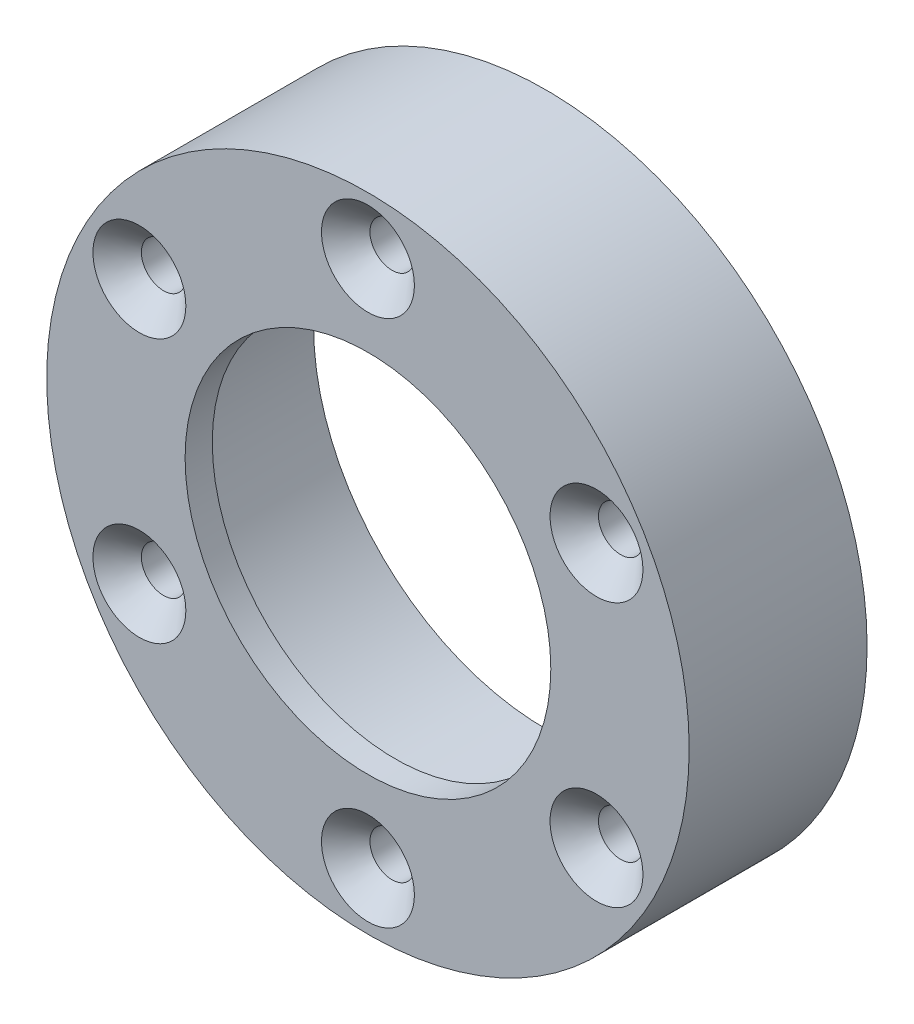
ISO-10303-21;
HEADER;
FILE_DESCRIPTION(('STEP AP214'),'2;1');
FILE_NAME('part.step','',(''),(''),'','','');
FILE_SCHEMA(('AUTOMOTIVE_DESIGN { 1 0 10303 214 1 1 1 1 }'));
ENDSEC;
DATA;
#1=APPLICATION_CONTEXT('core data for automotive mechanical design processes');
#2=APPLICATION_PROTOCOL_DEFINITION('international standard','automotive_design',2000,#1);
#3=PRODUCT_CONTEXT('',#1,'mechanical');
#4=PRODUCT('Part','Part','',(#3));
#5=PRODUCT_RELATED_PRODUCT_CATEGORY('part','',(#4));
#6=PRODUCT_DEFINITION_FORMATION('','',#4);
#7=PRODUCT_DEFINITION_CONTEXT('part definition',#1,'design');
#8=PRODUCT_DEFINITION('design','',#6,#7);
#9=PRODUCT_DEFINITION_SHAPE('','',#8);
#10=(LENGTH_UNIT() NAMED_UNIT(*) SI_UNIT(.MILLI.,.METRE.));
#11=(NAMED_UNIT(*) PLANE_ANGLE_UNIT() SI_UNIT($,.RADIAN.));
#12=(NAMED_UNIT(*) SI_UNIT($,.STERADIAN.) SOLID_ANGLE_UNIT());
#13=UNCERTAINTY_MEASURE_WITH_UNIT(LENGTH_MEASURE(1.E-05),#10,'distance_accuracy_value','');
#14=(GEOMETRIC_REPRESENTATION_CONTEXT(3) GLOBAL_UNCERTAINTY_ASSIGNED_CONTEXT((#13)) GLOBAL_UNIT_ASSIGNED_CONTEXT((#10,
#11,#12)) REPRESENTATION_CONTEXT('',''));
#15=CARTESIAN_POINT('',(0.,0.,0.));
#16=DIRECTION('',(0.,0.,1.));
#17=DIRECTION('',(1.,0.,0.));
#18=AXIS2_PLACEMENT_3D('',#15,#16,#17);
#19=CARTESIAN_POINT('',(0.,0.,30.));
#20=DIRECTION('',(0.,0.,-1.));
#21=DIRECTION('',(-1.,0.,0.));
#22=AXIS2_PLACEMENT_3D('',#19,#20,#21);
#23=CYLINDRICAL_SURFACE('',#22,18.5);
#24=CARTESIAN_POINT('',(0.,0.,18.));
#25=DIRECTION('',(0.,0.,1.));
#26=DIRECTION('',(1.,0.,0.));
#27=AXIS2_PLACEMENT_3D('',#24,#25,#26);
#28=CIRCLE('',#27,18.5);
#29=CARTESIAN_POINT('',(18.5,0.,18.));
#30=VERTEX_POINT('',#29);
#31=EDGE_CURVE('E105',#30,#30,#28,.T.);
#32=ORIENTED_EDGE('',*,*,#31,.T.);
#33=EDGE_LOOP('',(#32));
#34=FACE_BOUND('',#33,.T.);
#35=CARTESIAN_POINT('',(0.,0.,15.25));
#36=DIRECTION('',(0.,0.,-1.));
#37=DIRECTION('',(-1.,0.,0.));
#38=AXIS2_PLACEMENT_3D('',#35,#36,#37);
#39=CIRCLE('',#38,18.5);
#40=CARTESIAN_POINT('',(-18.5,0.,15.25));
#41=VERTEX_POINT('',#40);
#42=EDGE_CURVE('E41',#41,#41,#39,.F.);
#43=ORIENTED_EDGE('',*,*,#42,.F.);
#44=EDGE_LOOP('',(#43));
#45=FACE_BOUND('',#44,.T.);
#46=ADVANCED_FACE('F37',(#34,#45),#23,.F.);
#47=CARTESIAN_POINT('',(0.,0.,18.));
#48=DIRECTION('',(0.,0.,-1.));
#49=DIRECTION('',(-1.,0.,0.));
#50=AXIS2_PLACEMENT_3D('',#47,#48,#49);
#51=CYLINDRICAL_SURFACE('',#50,32.5);
#52=CARTESIAN_POINT('',(0.,0.,18.));
#53=DIRECTION('',(0.,0.,1.));
#54=DIRECTION('',(1.,0.,0.));
#55=AXIS2_PLACEMENT_3D('',#52,#53,#54);
#56=CIRCLE('',#55,32.5);
#57=CARTESIAN_POINT('',(32.5,0.,18.));
#58=VERTEX_POINT('',#57);
#59=EDGE_CURVE('E10',#58,#58,#56,.T.);
#60=ORIENTED_EDGE('',*,*,#59,.F.);
#61=EDGE_LOOP('',(#60));
#62=FACE_BOUND('',#61,.T.);
#63=CARTESIAN_POINT('',(0.,0.,0.));
#64=DIRECTION('',(0.,0.,1.));
#65=DIRECTION('',(1.,0.,0.));
#66=AXIS2_PLACEMENT_3D('',#63,#64,#65);
#67=CIRCLE('',#66,32.5);
#68=CARTESIAN_POINT('',(32.5,0.,0.));
#69=VERTEX_POINT('',#68);
#70=EDGE_CURVE('E45',#69,#69,#67,.T.);
#71=ORIENTED_EDGE('',*,*,#70,.T.);
#72=EDGE_LOOP('',(#71));
#73=FACE_BOUND('',#72,.T.);
#74=ADVANCED_FACE('F39',(#62,#73),#51,.T.);
#75=CARTESIAN_POINT('',(0.,0.,18.));
#76=DIRECTION('',(0.,0.,1.));
#77=DIRECTION('',(1.,0.,0.));
#78=AXIS2_PLACEMENT_3D('',#75,#76,#77);
#79=PLANE('',#78);
#80=ORIENTED_EDGE('',*,*,#31,.F.);
#81=EDGE_LOOP('',(#80));
#82=FACE_BOUND('',#81,.T.);
#83=CARTESIAN_POINT('',(23.1228782810444,13.3500000000003,18.));
#84=DIRECTION('',(0.,0.,1.));
#85=DIRECTION('',(1.,0.,0.));
#86=AXIS2_PLACEMENT_3D('',#83,#84,#85);
#87=CIRCLE('',#86,4.7);
#88=CARTESIAN_POINT('',(27.8228782810444,13.3500000000003,18.));
#89=VERTEX_POINT('',#88);
#90=EDGE_CURVE('E102',#89,#89,#87,.T.);
#91=ORIENTED_EDGE('',*,*,#90,.F.);
#92=EDGE_LOOP('',(#91));
#93=FACE_BOUND('',#92,.T.);
#94=CARTESIAN_POINT('',(23.1228782810446,-13.3499999999998,18.));
#95=DIRECTION('',(0.,0.,1.));
#96=DIRECTION('',(1.,0.,0.));
#97=AXIS2_PLACEMENT_3D('',#94,#95,#96);
#98=CIRCLE('',#97,4.7);
#99=CARTESIAN_POINT('',(27.8228782810446,-13.3499999999998,18.));
#100=VERTEX_POINT('',#99);
#101=EDGE_CURVE('E93',#100,#100,#98,.T.);
#102=ORIENTED_EDGE('',*,*,#101,.F.);
#103=EDGE_LOOP('',(#102));
#104=FACE_BOUND('',#103,.T.);
#105=CARTESIAN_POINT('',(0.,-26.7,18.));
#106=DIRECTION('',(0.,0.,1.));
#107=DIRECTION('',(1.,0.,0.));
#108=AXIS2_PLACEMENT_3D('',#105,#106,#107);
#109=CIRCLE('',#108,4.7);
#110=CARTESIAN_POINT('',(4.7,-26.7,18.));
#111=VERTEX_POINT('',#110);
#112=EDGE_CURVE('E84',#111,#111,#109,.T.);
#113=ORIENTED_EDGE('',*,*,#112,.F.);
#114=EDGE_LOOP('',(#113));
#115=FACE_BOUND('',#114,.T.);
#116=CARTESIAN_POINT('',(-23.1228782810444,-13.3500000000001,18.));
#117=DIRECTION('',(0.,0.,1.));
#118=DIRECTION('',(1.,0.,0.));
#119=AXIS2_PLACEMENT_3D('',#116,#117,#118);
#120=CIRCLE('',#119,4.7);
#121=CARTESIAN_POINT('',(-18.4228782810445,-13.3500000000001,18.));
#122=VERTEX_POINT('',#121);
#123=EDGE_CURVE('E75',#122,#122,#120,.T.);
#124=ORIENTED_EDGE('',*,*,#123,.F.);
#125=EDGE_LOOP('',(#124));
#126=FACE_BOUND('',#125,.T.);
#127=CARTESIAN_POINT('',(-23.1228782810445,13.3499999999999,18.));
#128=DIRECTION('',(0.,0.,1.));
#129=DIRECTION('',(1.,0.,0.));
#130=AXIS2_PLACEMENT_3D('',#127,#128,#129);
#131=CIRCLE('',#130,4.7);
#132=CARTESIAN_POINT('',(-18.4228782810445,13.3499999999999,18.));
#133=VERTEX_POINT('',#132);
#134=EDGE_CURVE('E66',#133,#133,#131,.T.);
#135=ORIENTED_EDGE('',*,*,#134,.F.);
#136=EDGE_LOOP('',(#135));
#137=FACE_BOUND('',#136,.T.);
#138=CARTESIAN_POINT('',(0.,26.7,18.));
#139=DIRECTION('',(0.,0.,1.));
#140=DIRECTION('',(1.,0.,0.));
#141=AXIS2_PLACEMENT_3D('',#138,#139,#140);
#142=CIRCLE('',#141,4.7);
#143=CARTESIAN_POINT('',(4.7,26.7,18.));
#144=VERTEX_POINT('',#143);
#145=EDGE_CURVE('E57',#144,#144,#142,.T.);
#146=ORIENTED_EDGE('',*,*,#145,.F.);
#147=EDGE_LOOP('',(#146));
#148=FACE_BOUND('',#147,.T.);
#149=ORIENTED_EDGE('',*,*,#59,.T.);
#150=EDGE_LOOP('',(#149));
#151=FACE_BOUND('',#150,.T.);
#152=ADVANCED_FACE('F128',(#82,#93,#104,#115,#126,#137,#148,#151),#79,.T.);
#153=CARTESIAN_POINT('',(0.,0.,0.));
#154=DIRECTION('',(0.,0.,1.));
#155=DIRECTION('',(1.,0.,0.));
#156=AXIS2_PLACEMENT_3D('',#153,#154,#155);
#157=PLANE('',#156);
#158=CARTESIAN_POINT('',(0.,0.,0.));
#159=DIRECTION('',(0.,0.,-1.));
#160=DIRECTION('',(-1.,0.,0.));
#161=AXIS2_PLACEMENT_3D('',#158,#159,#160);
#162=CIRCLE('',#161,23.5);
#163=CARTESIAN_POINT('',(-23.5,0.,0.));
#164=VERTEX_POINT('',#163);
#165=EDGE_CURVE('E108',#164,#164,#162,.T.);
#166=ORIENTED_EDGE('',*,*,#165,.F.);
#167=EDGE_LOOP('',(#166));
#168=FACE_BOUND('',#167,.T.);
#169=CARTESIAN_POINT('',(23.1228782810444,13.3500000000003,0.));
#170=DIRECTION('',(0.,0.,1.));
#171=DIRECTION('',(1.,0.,0.));
#172=AXIS2_PLACEMENT_3D('',#169,#170,#171);
#173=CIRCLE('',#172,2.25);
#174=CARTESIAN_POINT('',(25.3728782810444,13.3500000000003,0.));
#175=VERTEX_POINT('',#174);
#176=EDGE_CURVE('E96',#175,#175,#173,.T.);
#177=ORIENTED_EDGE('',*,*,#176,.T.);
#178=EDGE_LOOP('',(#177));
#179=FACE_BOUND('',#178,.T.);
#180=CARTESIAN_POINT('',(23.1228782810446,-13.3499999999998,0.));
#181=DIRECTION('',(0.,0.,1.));
#182=DIRECTION('',(1.,0.,0.));
#183=AXIS2_PLACEMENT_3D('',#180,#181,#182);
#184=CIRCLE('',#183,2.25);
#185=CARTESIAN_POINT('',(25.3728782810446,-13.3499999999998,0.));
#186=VERTEX_POINT('',#185);
#187=EDGE_CURVE('E87',#186,#186,#184,.T.);
#188=ORIENTED_EDGE('',*,*,#187,.T.);
#189=EDGE_LOOP('',(#188));
#190=FACE_BOUND('',#189,.T.);
#191=CARTESIAN_POINT('',(0.,-26.7,0.));
#192=DIRECTION('',(0.,0.,1.));
#193=DIRECTION('',(1.,0.,0.));
#194=AXIS2_PLACEMENT_3D('',#191,#192,#193);
#195=CIRCLE('',#194,2.25);
#196=CARTESIAN_POINT('',(2.25,-26.7,0.));
#197=VERTEX_POINT('',#196);
#198=EDGE_CURVE('E78',#197,#197,#195,.T.);
#199=ORIENTED_EDGE('',*,*,#198,.T.);
#200=EDGE_LOOP('',(#199));
#201=FACE_BOUND('',#200,.T.);
#202=CARTESIAN_POINT('',(-23.1228782810444,-13.3500000000001,0.));
#203=DIRECTION('',(0.,0.,1.));
#204=DIRECTION('',(1.,0.,0.));
#205=AXIS2_PLACEMENT_3D('',#202,#203,#204);
#206=CIRCLE('',#205,2.25);
#207=CARTESIAN_POINT('',(-20.8728782810445,-13.3500000000001,0.));
#208=VERTEX_POINT('',#207);
#209=EDGE_CURVE('E69',#208,#208,#206,.T.);
#210=ORIENTED_EDGE('',*,*,#209,.T.);
#211=EDGE_LOOP('',(#210));
#212=FACE_BOUND('',#211,.T.);
#213=CARTESIAN_POINT('',(-23.1228782810445,13.3499999999999,0.));
#214=DIRECTION('',(0.,0.,1.));
#215=DIRECTION('',(1.,0.,0.));
#216=AXIS2_PLACEMENT_3D('',#213,#214,#215);
#217=CIRCLE('',#216,2.25);
#218=CARTESIAN_POINT('',(-20.8728782810445,13.3499999999999,0.));
#219=VERTEX_POINT('',#218);
#220=EDGE_CURVE('E60',#219,#219,#217,.T.);
#221=ORIENTED_EDGE('',*,*,#220,.T.);
#222=EDGE_LOOP('',(#221));
#223=FACE_BOUND('',#222,.T.);
#224=CARTESIAN_POINT('',(0.,26.7,0.));
#225=DIRECTION('',(0.,0.,1.));
#226=DIRECTION('',(1.,0.,0.));
#227=AXIS2_PLACEMENT_3D('',#224,#225,#226);
#228=CIRCLE('',#227,2.25);
#229=CARTESIAN_POINT('',(2.25,26.7,0.));
#230=VERTEX_POINT('',#229);
#231=EDGE_CURVE('E50',#230,#230,#228,.T.);
#232=ORIENTED_EDGE('',*,*,#231,.T.);
#233=EDGE_LOOP('',(#232));
#234=FACE_BOUND('',#233,.T.);
#235=ORIENTED_EDGE('',*,*,#70,.F.);
#236=EDGE_LOOP('',(#235));
#237=FACE_BOUND('',#236,.T.);
#238=ADVANCED_FACE('F181',(#168,#179,#190,#201,#212,#223,#234,#237),#157,.F.);
#239=CARTESIAN_POINT('',(0.,26.7,18.));
#240=DIRECTION('',(0.,0.,1.));
#241=DIRECTION('',(1.,0.,0.));
#242=AXIS2_PLACEMENT_3D('',#239,#240,#241);
#243=CYLINDRICAL_SURFACE('',#242,2.25);
#244=ORIENTED_EDGE('',*,*,#231,.F.);
#245=EDGE_LOOP('',(#244));
#246=FACE_BOUND('',#245,.T.);
#247=CARTESIAN_POINT('',(0.,26.7,15.55));
#248=DIRECTION('',(0.,0.,1.));
#249=DIRECTION('',(1.,0.,0.));
#250=AXIS2_PLACEMENT_3D('',#247,#248,#249);
#251=CIRCLE('',#250,2.25);
#252=CARTESIAN_POINT('',(2.25,26.7,15.55));
#253=VERTEX_POINT('',#252);
#254=EDGE_CURVE('E54',#253,#253,#251,.T.);
#255=ORIENTED_EDGE('',*,*,#254,.T.);
#256=EDGE_LOOP('',(#255));
#257=FACE_BOUND('',#256,.T.);
#258=ADVANCED_FACE('F177',(#246,#257),#243,.F.);
#259=CARTESIAN_POINT('',(0.,26.7,18.));
#260=DIRECTION('',(0.,0.,1.));
#261=DIRECTION('',(1.,0.,0.));
#262=AXIS2_PLACEMENT_3D('',#259,#260,#261);
#263=CONICAL_SURFACE('',#262,4.7,0.785398163397449);
#264=ORIENTED_EDGE('',*,*,#254,.F.);
#265=EDGE_LOOP('',(#264));
#266=FACE_BOUND('',#265,.T.);
#267=ORIENTED_EDGE('',*,*,#145,.T.);
#268=EDGE_LOOP('',(#267));
#269=FACE_BOUND('',#268,.T.);
#270=ADVANCED_FACE('F173',(#266,#269),#263,.F.);
#271=CARTESIAN_POINT('',(-23.1228782810445,13.3499999999999,18.));
#272=DIRECTION('',(0.,0.,1.));
#273=DIRECTION('',(1.,0.,0.));
#274=AXIS2_PLACEMENT_3D('',#271,#272,#273);
#275=CYLINDRICAL_SURFACE('',#274,2.25);
#276=ORIENTED_EDGE('',*,*,#220,.F.);
#277=EDGE_LOOP('',(#276));
#278=FACE_BOUND('',#277,.T.);
#279=CARTESIAN_POINT('',(-23.1228782810445,13.3499999999999,15.55));
#280=DIRECTION('',(0.,0.,1.));
#281=DIRECTION('',(1.,0.,0.));
#282=AXIS2_PLACEMENT_3D('',#279,#280,#281);
#283=CIRCLE('',#282,2.25);
#284=CARTESIAN_POINT('',(-20.8728782810445,13.3499999999999,15.55));
#285=VERTEX_POINT('',#284);
#286=EDGE_CURVE('E63',#285,#285,#283,.T.);
#287=ORIENTED_EDGE('',*,*,#286,.T.);
#288=EDGE_LOOP('',(#287));
#289=FACE_BOUND('',#288,.T.);
#290=ADVANCED_FACE('F169',(#278,#289),#275,.F.);
#291=CARTESIAN_POINT('',(-23.1228782810445,13.3499999999999,18.));
#292=DIRECTION('',(0.,0.,1.));
#293=DIRECTION('',(1.,0.,0.));
#294=AXIS2_PLACEMENT_3D('',#291,#292,#293);
#295=CONICAL_SURFACE('',#294,4.7,0.785398163397449);
#296=ORIENTED_EDGE('',*,*,#286,.F.);
#297=EDGE_LOOP('',(#296));
#298=FACE_BOUND('',#297,.T.);
#299=ORIENTED_EDGE('',*,*,#134,.T.);
#300=EDGE_LOOP('',(#299));
#301=FACE_BOUND('',#300,.T.);
#302=ADVANCED_FACE('F165',(#298,#301),#295,.F.);
#303=CARTESIAN_POINT('',(-23.1228782810444,-13.3500000000001,18.));
#304=DIRECTION('',(0.,0.,1.));
#305=DIRECTION('',(1.,0.,0.));
#306=AXIS2_PLACEMENT_3D('',#303,#304,#305);
#307=CYLINDRICAL_SURFACE('',#306,2.25);
#308=ORIENTED_EDGE('',*,*,#209,.F.);
#309=EDGE_LOOP('',(#308));
#310=FACE_BOUND('',#309,.T.);
#311=CARTESIAN_POINT('',(-23.1228782810444,-13.3500000000001,15.55));
#312=DIRECTION('',(0.,0.,1.));
#313=DIRECTION('',(1.,0.,0.));
#314=AXIS2_PLACEMENT_3D('',#311,#312,#313);
#315=CIRCLE('',#314,2.25);
#316=CARTESIAN_POINT('',(-20.8728782810445,-13.3500000000001,15.55));
#317=VERTEX_POINT('',#316);
#318=EDGE_CURVE('E72',#317,#317,#315,.T.);
#319=ORIENTED_EDGE('',*,*,#318,.T.);
#320=EDGE_LOOP('',(#319));
#321=FACE_BOUND('',#320,.T.);
#322=ADVANCED_FACE('F161',(#310,#321),#307,.F.);
#323=CARTESIAN_POINT('',(-23.1228782810444,-13.3500000000001,18.));
#324=DIRECTION('',(0.,0.,1.));
#325=DIRECTION('',(1.,0.,0.));
#326=AXIS2_PLACEMENT_3D('',#323,#324,#325);
#327=CONICAL_SURFACE('',#326,4.7,0.785398163397449);
#328=ORIENTED_EDGE('',*,*,#318,.F.);
#329=EDGE_LOOP('',(#328));
#330=FACE_BOUND('',#329,.T.);
#331=ORIENTED_EDGE('',*,*,#123,.T.);
#332=EDGE_LOOP('',(#331));
#333=FACE_BOUND('',#332,.T.);
#334=ADVANCED_FACE('F157',(#330,#333),#327,.F.);
#335=CARTESIAN_POINT('',(0.,-26.7,18.));
#336=DIRECTION('',(0.,0.,1.));
#337=DIRECTION('',(1.,0.,0.));
#338=AXIS2_PLACEMENT_3D('',#335,#336,#337);
#339=CYLINDRICAL_SURFACE('',#338,2.25);
#340=ORIENTED_EDGE('',*,*,#198,.F.);
#341=EDGE_LOOP('',(#340));
#342=FACE_BOUND('',#341,.T.);
#343=CARTESIAN_POINT('',(0.,-26.7,15.55));
#344=DIRECTION('',(0.,0.,1.));
#345=DIRECTION('',(1.,0.,0.));
#346=AXIS2_PLACEMENT_3D('',#343,#344,#345);
#347=CIRCLE('',#346,2.25);
#348=CARTESIAN_POINT('',(2.25,-26.7,15.55));
#349=VERTEX_POINT('',#348);
#350=EDGE_CURVE('E81',#349,#349,#347,.T.);
#351=ORIENTED_EDGE('',*,*,#350,.T.);
#352=EDGE_LOOP('',(#351));
#353=FACE_BOUND('',#352,.T.);
#354=ADVANCED_FACE('F153',(#342,#353),#339,.F.);
#355=CARTESIAN_POINT('',(0.,-26.7,18.));
#356=DIRECTION('',(0.,0.,1.));
#357=DIRECTION('',(1.,0.,0.));
#358=AXIS2_PLACEMENT_3D('',#355,#356,#357);
#359=CONICAL_SURFACE('',#358,4.7,0.785398163397449);
#360=ORIENTED_EDGE('',*,*,#350,.F.);
#361=EDGE_LOOP('',(#360));
#362=FACE_BOUND('',#361,.T.);
#363=ORIENTED_EDGE('',*,*,#112,.T.);
#364=EDGE_LOOP('',(#363));
#365=FACE_BOUND('',#364,.T.);
#366=ADVANCED_FACE('F149',(#362,#365),#359,.F.);
#367=CARTESIAN_POINT('',(23.1228782810446,-13.3499999999998,18.));
#368=DIRECTION('',(0.,0.,1.));
#369=DIRECTION('',(1.,0.,0.));
#370=AXIS2_PLACEMENT_3D('',#367,#368,#369);
#371=CYLINDRICAL_SURFACE('',#370,2.25);
#372=ORIENTED_EDGE('',*,*,#187,.F.);
#373=EDGE_LOOP('',(#372));
#374=FACE_BOUND('',#373,.T.);
#375=CARTESIAN_POINT('',(23.1228782810446,-13.3499999999998,15.55));
#376=DIRECTION('',(0.,0.,1.));
#377=DIRECTION('',(1.,0.,0.));
#378=AXIS2_PLACEMENT_3D('',#375,#376,#377);
#379=CIRCLE('',#378,2.25);
#380=CARTESIAN_POINT('',(25.3728782810446,-13.3499999999998,15.55));
#381=VERTEX_POINT('',#380);
#382=EDGE_CURVE('E90',#381,#381,#379,.T.);
#383=ORIENTED_EDGE('',*,*,#382,.T.);
#384=EDGE_LOOP('',(#383));
#385=FACE_BOUND('',#384,.T.);
#386=ADVANCED_FACE('F145',(#374,#385),#371,.F.);
#387=CARTESIAN_POINT('',(23.1228782810446,-13.3499999999998,18.));
#388=DIRECTION('',(0.,0.,1.));
#389=DIRECTION('',(1.,0.,0.));
#390=AXIS2_PLACEMENT_3D('',#387,#388,#389);
#391=CONICAL_SURFACE('',#390,4.7,0.785398163397449);
#392=ORIENTED_EDGE('',*,*,#382,.F.);
#393=EDGE_LOOP('',(#392));
#394=FACE_BOUND('',#393,.T.);
#395=ORIENTED_EDGE('',*,*,#101,.T.);
#396=EDGE_LOOP('',(#395));
#397=FACE_BOUND('',#396,.T.);
#398=ADVANCED_FACE('F141',(#394,#397),#391,.F.);
#399=CARTESIAN_POINT('',(23.1228782810444,13.3500000000003,18.));
#400=DIRECTION('',(0.,0.,1.));
#401=DIRECTION('',(1.,0.,0.));
#402=AXIS2_PLACEMENT_3D('',#399,#400,#401);
#403=CYLINDRICAL_SURFACE('',#402,2.25);
#404=ORIENTED_EDGE('',*,*,#176,.F.);
#405=EDGE_LOOP('',(#404));
#406=FACE_BOUND('',#405,.T.);
#407=CARTESIAN_POINT('',(23.1228782810444,13.3500000000003,15.55));
#408=DIRECTION('',(0.,0.,1.));
#409=DIRECTION('',(1.,0.,0.));
#410=AXIS2_PLACEMENT_3D('',#407,#408,#409);
#411=CIRCLE('',#410,2.25);
#412=CARTESIAN_POINT('',(25.3728782810444,13.3500000000003,15.55));
#413=VERTEX_POINT('',#412);
#414=EDGE_CURVE('E99',#413,#413,#411,.T.);
#415=ORIENTED_EDGE('',*,*,#414,.T.);
#416=EDGE_LOOP('',(#415));
#417=FACE_BOUND('',#416,.T.);
#418=ADVANCED_FACE('F137',(#406,#417),#403,.F.);
#419=CARTESIAN_POINT('',(23.1228782810444,13.3500000000003,18.));
#420=DIRECTION('',(0.,0.,1.));
#421=DIRECTION('',(1.,0.,0.));
#422=AXIS2_PLACEMENT_3D('',#419,#420,#421);
#423=CONICAL_SURFACE('',#422,4.7,0.785398163397449);
#424=ORIENTED_EDGE('',*,*,#414,.F.);
#425=EDGE_LOOP('',(#424));
#426=FACE_BOUND('',#425,.T.);
#427=ORIENTED_EDGE('',*,*,#90,.T.);
#428=EDGE_LOOP('',(#427));
#429=FACE_BOUND('',#428,.T.);
#430=ADVANCED_FACE('F134',(#426,#429),#423,.F.);
#431=CARTESIAN_POINT('',(0.,0.,15.25));
#432=DIRECTION('',(0.,0.,-1.));
#433=DIRECTION('',(-1.,0.,0.));
#434=AXIS2_PLACEMENT_3D('',#431,#432,#433);
#435=PLANE('',#434);
#436=CARTESIAN_POINT('',(0.,0.,15.25));
#437=DIRECTION('',(0.,0.,-1.));
#438=DIRECTION('',(-1.,0.,0.));
#439=AXIS2_PLACEMENT_3D('',#436,#437,#438);
#440=CIRCLE('',#439,23.5);
#441=CARTESIAN_POINT('',(-23.5,0.,15.25));
#442=VERTEX_POINT('',#441);
#443=EDGE_CURVE('E111',#442,#442,#440,.T.);
#444=ORIENTED_EDGE('',*,*,#443,.T.);
#445=EDGE_LOOP('',(#444));
#446=FACE_BOUND('',#445,.T.);
#447=ORIENTED_EDGE('',*,*,#42,.T.);
#448=EDGE_LOOP('',(#447));
#449=FACE_BOUND('',#448,.T.);
#450=ADVANCED_FACE('F118',(#446,#449),#435,.T.);
#451=CARTESIAN_POINT('',(0.,0.,15.25));
#452=DIRECTION('',(0.,0.,-1.));
#453=DIRECTION('',(-1.,0.,0.));
#454=AXIS2_PLACEMENT_3D('',#451,#452,#453);
#455=CYLINDRICAL_SURFACE('',#454,23.5);
#456=CARTESIAN_POINT('',(-23.5,0.,15.25));
#457=CARTESIAN_POINT('',(-23.5,0.,15.0911458333333));
#458=CARTESIAN_POINT('',(-23.5,0.,14.9322916666667));
#459=CARTESIAN_POINT('',(-23.5,0.,14.6145833333333));
#460=CARTESIAN_POINT('',(-23.5,0.,14.4557291666667));
#461=CARTESIAN_POINT('',(-23.5,0.,14.1380208333333));
#462=CARTESIAN_POINT('',(-23.5,0.,13.9791666666667));
#463=CARTESIAN_POINT('',(-23.5,0.,13.6614583333333));
#464=CARTESIAN_POINT('',(-23.5,0.,13.5026041666667));
#465=CARTESIAN_POINT('',(-23.5,0.,13.1848958333333));
#466=CARTESIAN_POINT('',(-23.5,0.,13.0260416666667));
#467=CARTESIAN_POINT('',(-23.5,0.,12.7083333333333));
#468=CARTESIAN_POINT('',(-23.5,0.,12.5494791666667));
#469=CARTESIAN_POINT('',(-23.5,0.,12.2317708333333));
#470=CARTESIAN_POINT('',(-23.5,0.,12.0729166666667));
#471=CARTESIAN_POINT('',(-23.5,0.,11.7552083333333));
#472=CARTESIAN_POINT('',(-23.5,0.,11.5963541666667));
#473=CARTESIAN_POINT('',(-23.5,0.,11.2786458333333));
#474=CARTESIAN_POINT('',(-23.5,0.,11.1197916666667));
#475=CARTESIAN_POINT('',(-23.5,0.,10.8020833333333));
#476=CARTESIAN_POINT('',(-23.5,0.,10.6432291666667));
#477=CARTESIAN_POINT('',(-23.5,0.,10.3255208333333));
#478=CARTESIAN_POINT('',(-23.5,0.,10.1666666666667));
#479=CARTESIAN_POINT('',(-23.5,0.,9.84895833333333));
#480=CARTESIAN_POINT('',(-23.5,0.,9.69010416666667));
#481=CARTESIAN_POINT('',(-23.5,0.,9.37239583333334));
#482=CARTESIAN_POINT('',(-23.5,0.,9.21354166666667));
#483=CARTESIAN_POINT('',(-23.5,0.,8.89583333333334));
#484=CARTESIAN_POINT('',(-23.5,0.,8.73697916666667));
#485=CARTESIAN_POINT('',(-23.5,0.,8.41927083333334));
#486=CARTESIAN_POINT('',(-23.5,0.,8.26041666666667));
#487=CARTESIAN_POINT('',(-23.5,0.,7.94270833333333));
#488=CARTESIAN_POINT('',(-23.5,0.,7.78385416666667));
#489=CARTESIAN_POINT('',(-23.5,0.,7.46614583333333));
#490=CARTESIAN_POINT('',(-23.5,0.,7.30729166666667));
#491=CARTESIAN_POINT('',(-23.5,0.,6.98958333333334));
#492=CARTESIAN_POINT('',(-23.5,0.,6.83072916666667));
#493=CARTESIAN_POINT('',(-23.5,0.,6.51302083333333));
#494=CARTESIAN_POINT('',(-23.5,0.,6.35416666666667));
#495=CARTESIAN_POINT('',(-23.5,0.,6.03645833333333));
#496=CARTESIAN_POINT('',(-23.5,0.,5.87760416666667));
#497=CARTESIAN_POINT('',(-23.5,0.,5.55989583333333));
#498=CARTESIAN_POINT('',(-23.5,0.,5.40104166666667));
#499=CARTESIAN_POINT('',(-23.5,0.,5.08333333333333));
#500=CARTESIAN_POINT('',(-23.5,0.,4.92447916666667));
#501=CARTESIAN_POINT('',(-23.5,0.,4.60677083333333));
#502=CARTESIAN_POINT('',(-23.5,0.,4.44791666666667));
#503=CARTESIAN_POINT('',(-23.5,0.,4.13020833333333));
#504=CARTESIAN_POINT('',(-23.5,0.,3.97135416666667));
#505=CARTESIAN_POINT('',(-23.5,0.,3.65364583333334));
#506=CARTESIAN_POINT('',(-23.5,0.,3.49479166666667));
#507=CARTESIAN_POINT('',(-23.5,0.,3.17708333333334));
#508=CARTESIAN_POINT('',(-23.5,0.,3.01822916666667));
#509=CARTESIAN_POINT('',(-23.5,0.,2.70052083333334));
#510=CARTESIAN_POINT('',(-23.5,0.,2.54166666666667));
#511=CARTESIAN_POINT('',(-23.5,0.,2.22395833333333));
#512=CARTESIAN_POINT('',(-23.5,0.,2.06510416666667));
#513=CARTESIAN_POINT('',(-23.5,0.,1.74739583333334));
#514=CARTESIAN_POINT('',(-23.5,0.,1.58854166666667));
#515=CARTESIAN_POINT('',(-23.5,0.,1.27083333333334));
#516=CARTESIAN_POINT('',(-23.5,0.,1.11197916666667));
#517=CARTESIAN_POINT('',(-23.5,0.,0.794270833333334));
#518=CARTESIAN_POINT('',(-23.5,0.,0.635416666666668));
#519=CARTESIAN_POINT('',(-23.5,0.,0.317708333333335));
#520=CARTESIAN_POINT('',(-23.5,0.,0.158854166666668));
#521=CARTESIAN_POINT('',(-23.5,0.,0.));
#522=B_SPLINE_CURVE_WITH_KNOTS('',3,(#456,#457,#458,#459,#460,#461,#462,#463,#464,#465,#466,
#467,#468,#469,#470,#471,#472,#473,#474,#475,#476,#477,#478,#479,#480,#481,#482,#483,#484,#485,
#486,#487,#488,#489,#490,#491,#492,#493,#494,#495,#496,#497,#498,#499,#500,#501,#502,#503,#504,
#505,#506,#507,#508,#509,#510,#511,#512,#513,#514,#515,#516,#517,#518,#519,#520,#521),
.UNSPECIFIED.,.F.,.F.,(4,2,2,2,2,2,2,2,2,2,2,2,2,2,2,2,2,2,2,2,2,2,2,2,2,2,2,2,2,2,2,2,4),(0.,
0.4765625,0.953124999999999,1.4296875,1.90625,2.3828125,2.859375,3.3359375,3.8125,4.2890625,
4.765625,5.2421875,5.71875,6.1953125,6.671875,7.1484375,7.625,8.1015625,8.578125,9.0546875,
9.53125,10.0078125,10.484375,10.9609375,11.4375,11.9140625,12.390625,12.8671875,13.34375,
13.8203125,14.296875,14.7734375,15.25),.UNSPECIFIED.);
#523=EDGE_CURVE('BSEAM132',#442,#164,#522,.T.);
#524=ORIENTED_EDGE('',*,*,#443,.F.);
#525=ORIENTED_EDGE('',*,*,#165,.T.);
#526=ORIENTED_EDGE('',*,*,#523,.T.);
#527=ORIENTED_EDGE('',*,*,#523,.F.);
#528=EDGE_LOOP('',(#524,#526,#525,#527));
#529=FACE_BOUND('',#528,.T.);
#530=ADVANCED_FACE('F132',(#529),#455,.F.);
#531=CLOSED_SHELL('',(#46,#74,#152,#238,#258,#270,#290,#302,#322,#334,#354,#366,#386,#398,#418,
#430,#450,#530));
#532=MANIFOLD_SOLID_BREP('B2',#531);
#533=ADVANCED_BREP_SHAPE_REPRESENTATION('',(#18,#532),#14);
#534=SHAPE_DEFINITION_REPRESENTATION(#9,#533);
ENDSEC;
END-ISO-10303-21;
